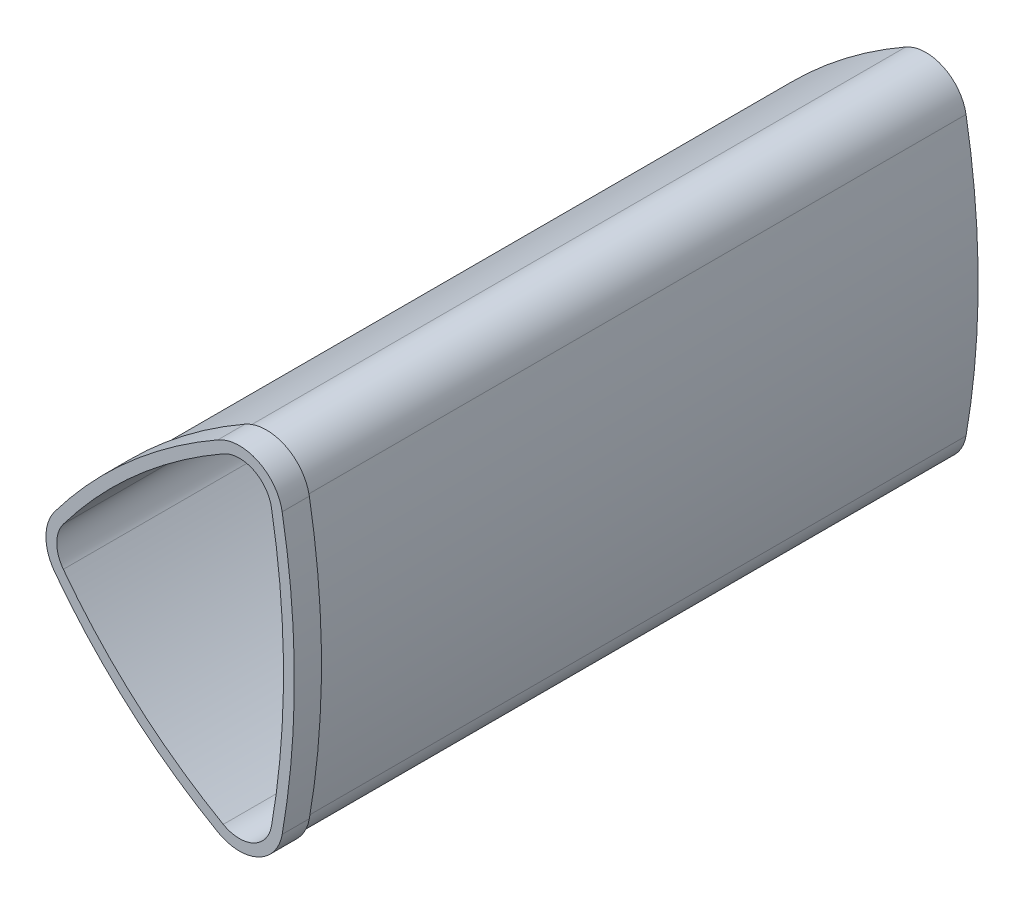
ISO-10303-21;
HEADER;
FILE_DESCRIPTION(('STEP AP214'),'2;1');
FILE_NAME('part.step','',(''),(''),'','','');
FILE_SCHEMA(('AUTOMOTIVE_DESIGN { 1 0 10303 214 1 1 1 1 }'));
ENDSEC;
DATA;
#1=APPLICATION_CONTEXT('core data for automotive mechanical design processes');
#2=APPLICATION_PROTOCOL_DEFINITION('international standard','automotive_design',2000,#1);
#3=PRODUCT_CONTEXT('',#1,'mechanical');
#4=PRODUCT('Part','Part','',(#3));
#5=PRODUCT_RELATED_PRODUCT_CATEGORY('part','',(#4));
#6=PRODUCT_DEFINITION_FORMATION('','',#4);
#7=PRODUCT_DEFINITION_CONTEXT('part definition',#1,'design');
#8=PRODUCT_DEFINITION('design','',#6,#7);
#9=PRODUCT_DEFINITION_SHAPE('','',#8);
#10=(LENGTH_UNIT() NAMED_UNIT(*) SI_UNIT(.MILLI.,.METRE.));
#11=(NAMED_UNIT(*) PLANE_ANGLE_UNIT() SI_UNIT($,.RADIAN.));
#12=(NAMED_UNIT(*) SI_UNIT($,.STERADIAN.) SOLID_ANGLE_UNIT());
#13=UNCERTAINTY_MEASURE_WITH_UNIT(LENGTH_MEASURE(1.E-05),#10,'distance_accuracy_value','');
#14=(GEOMETRIC_REPRESENTATION_CONTEXT(3) GLOBAL_UNCERTAINTY_ASSIGNED_CONTEXT((#13)) GLOBAL_UNIT_ASSIGNED_CONTEXT((#10,
#11,#12)) REPRESENTATION_CONTEXT('',''));
#15=CARTESIAN_POINT('',(0.,0.,0.));
#16=DIRECTION('',(0.,0.,1.));
#17=DIRECTION('',(1.,0.,0.));
#18=AXIS2_PLACEMENT_3D('',#15,#16,#17);
#19=CARTESIAN_POINT('',(7.29,-48.71,3.));
#20=DIRECTION('',(0.,0.,-1.));
#21=DIRECTION('',(-1.,0.,0.));
#22=AXIS2_PLACEMENT_3D('',#19,#20,#21);
#23=CYLINDRICAL_SURFACE('',#22,15.);
#24=CARTESIAN_POINT('',(7.29,-48.71,243.));
#25=DIRECTION('',(0.,0.,1.));
#26=DIRECTION('',(1.,0.,0.));
#27=AXIS2_PLACEMENT_3D('',#24,#25,#26);
#28=CIRCLE('',#27,15.);
#29=CARTESIAN_POINT('',(-0.139087029674166,-61.7410654171302,243.));
#30=VERTEX_POINT('',#29);
#31=CARTESIAN_POINT('',(22.0645368627523,-51.3009574468086,243.));
#32=VERTEX_POINT('',#31);
#33=EDGE_CURVE('E259',#30,#32,#28,.T.);
#34=ORIENTED_EDGE('',*,*,#33,.F.);
#35=DIRECTION('',(0.,0.,-1.));
#36=VECTOR('',#35,1.);
#37=CARTESIAN_POINT('',(-0.139087029674106,-61.7410654171302,3.));
#38=LINE('',#37,#36);
#39=CARTESIAN_POINT('',(-0.139087029674106,-61.7410654171302,0.));
#40=VERTEX_POINT('',#39);
#41=EDGE_CURVE('E268',#30,#40,#38,.T.);
#42=ORIENTED_EDGE('',*,*,#41,.T.);
#43=CARTESIAN_POINT('',(7.29,-48.71,0.));
#44=DIRECTION('',(0.,0.,1.));
#45=DIRECTION('',(1.,0.,0.));
#46=AXIS2_PLACEMENT_3D('',#43,#44,#45);
#47=CIRCLE('',#46,15.);
#48=CARTESIAN_POINT('',(22.0645368627523,-51.3009574468086,0.));
#49=VERTEX_POINT('',#48);
#50=EDGE_CURVE('E302',#40,#49,#47,.T.);
#51=ORIENTED_EDGE('',*,*,#50,.T.);
#52=DIRECTION('',(0.,0.,-1.));
#53=VECTOR('',#52,1.);
#54=CARTESIAN_POINT('',(22.0645368627523,-51.3009574468086,3.));
#55=LINE('',#54,#53);
#56=EDGE_CURVE('E12',#32,#49,#55,.T.);
#57=ORIENTED_EDGE('',*,*,#56,.F.);
#58=EDGE_LOOP('',(#34,#42,#51,#57));
#59=FACE_BOUND('',#58,.T.);
#60=ADVANCED_FACE('F131',(#59),#23,.T.);
#61=CARTESIAN_POINT('',(-270.471293019744,0.,3.));
#62=DIRECTION('',(0.,0.,-1.));
#63=DIRECTION('',(-1.,0.,0.));
#64=AXIS2_PLACEMENT_3D('',#61,#62,#63);
#65=CYLINDRICAL_SURFACE('',#64,297.);
#66=CARTESIAN_POINT('',(-270.471293019744,0.,243.));
#67=DIRECTION('',(0.,0.,1.));
#68=DIRECTION('',(1.,0.,0.));
#69=AXIS2_PLACEMENT_3D('',#66,#67,#68);
#70=CIRCLE('',#69,297.);
#71=CARTESIAN_POINT('',(22.0645368627523,51.3009574468085,243.));
#72=VERTEX_POINT('',#71);
#73=EDGE_CURVE('E269',#32,#72,#70,.T.);
#74=ORIENTED_EDGE('',*,*,#73,.F.);
#75=ORIENTED_EDGE('',*,*,#56,.T.);
#76=CARTESIAN_POINT('',(-270.471293019744,0.,0.));
#77=DIRECTION('',(0.,0.,1.));
#78=DIRECTION('',(1.,0.,0.));
#79=AXIS2_PLACEMENT_3D('',#76,#77,#78);
#80=CIRCLE('',#79,297.);
#81=CARTESIAN_POINT('',(22.0645368627523,51.3009574468085,0.));
#82=VERTEX_POINT('',#81);
#83=EDGE_CURVE('E299',#49,#82,#80,.T.);
#84=ORIENTED_EDGE('',*,*,#83,.T.);
#85=DIRECTION('',(0.,0.,-1.));
#86=VECTOR('',#85,1.);
#87=CARTESIAN_POINT('',(22.0645368627523,51.3009574468085,3.));
#88=LINE('',#87,#86);
#89=EDGE_CURVE('E143',#72,#82,#88,.T.);
#90=ORIENTED_EDGE('',*,*,#89,.F.);
#91=EDGE_LOOP('',(#74,#75,#84,#90));
#92=FACE_BOUND('',#91,.T.);
#93=ADVANCED_FACE('F296',(#92),#65,.T.);
#94=CARTESIAN_POINT('',(7.28999999999999,48.71,3.));
#95=DIRECTION('',(0.,0.,-1.));
#96=DIRECTION('',(-1.,0.,0.));
#97=AXIS2_PLACEMENT_3D('',#94,#95,#96);
#98=CYLINDRICAL_SURFACE('',#97,15.);
#99=DIRECTION('',(0.,0.,-1.));
#100=VECTOR('',#99,1.);
#101=CARTESIAN_POINT('',(-0.139087029674106,61.7410654171303,3.));
#102=LINE('',#101,#100);
#103=CARTESIAN_POINT('',(-0.139087029674106,61.7410654171303,243.));
#104=VERTEX_POINT('',#103);
#105=CARTESIAN_POINT('',(-0.139087029674106,61.7410654171303,0.));
#106=VERTEX_POINT('',#105);
#107=EDGE_CURVE('E283',#104,#106,#102,.T.);
#108=ORIENTED_EDGE('',*,*,#107,.F.);
#109=CARTESIAN_POINT('',(7.28999999999999,48.71,243.));
#110=DIRECTION('',(0.,0.,1.));
#111=DIRECTION('',(1.,0.,0.));
#112=AXIS2_PLACEMENT_3D('',#109,#110,#111);
#113=CIRCLE('',#112,15.);
#114=EDGE_CURVE('E293',#72,#104,#113,.T.);
#115=ORIENTED_EDGE('',*,*,#114,.F.);
#116=ORIENTED_EDGE('',*,*,#89,.T.);
#117=CARTESIAN_POINT('',(7.28999999999999,48.71,0.));
#118=DIRECTION('',(0.,0.,-1.));
#119=DIRECTION('',(-1.,0.,0.));
#120=AXIS2_PLACEMENT_3D('',#117,#118,#119);
#121=CIRCLE('',#120,15.);
#122=EDGE_CURVE('E294',#106,#82,#121,.T.);
#123=ORIENTED_EDGE('',*,*,#122,.F.);
#124=EDGE_LOOP('',(#108,#115,#116,#123));
#125=FACE_BOUND('',#124,.T.);
#126=ADVANCED_FACE('F295',(#125),#98,.T.);
#127=CARTESIAN_POINT('',(97.4295892933787,-109.400260394514,3.));
#128=DIRECTION('',(0.,0.,-1.));
#129=DIRECTION('',(-1.,0.,0.));
#130=AXIS2_PLACEMENT_3D('',#127,#128,#129);
#131=CYLINDRICAL_SURFACE('',#130,197.);
#132=CARTESIAN_POINT('',(97.4295892933787,-109.400260394514,243.));
#133=DIRECTION('',(0.,0.,1.));
#134=DIRECTION('',(1.,0.,0.));
#135=AXIS2_PLACEMENT_3D('',#132,#133,#134);
#136=CIRCLE('',#135,197.);
#137=CARTESIAN_POINT('',(-60.0076035131906,9.01650497756986,243.));
#138=VERTEX_POINT('',#137);
#139=EDGE_CURVE('E413',#104,#138,#136,.T.);
#140=ORIENTED_EDGE('',*,*,#139,.F.);
#141=ORIENTED_EDGE('',*,*,#107,.T.);
#142=CARTESIAN_POINT('',(97.4295892933787,-109.400260394514,0.));
#143=DIRECTION('',(0.,0.,1.));
#144=DIRECTION('',(1.,0.,0.));
#145=AXIS2_PLACEMENT_3D('',#142,#143,#144);
#146=CIRCLE('',#145,197.);
#147=CARTESIAN_POINT('',(-60.0076035131906,9.01650497756987,0.));
#148=VERTEX_POINT('',#147);
#149=EDGE_CURVE('E306',#106,#148,#146,.T.);
#150=ORIENTED_EDGE('',*,*,#149,.T.);
#151=DIRECTION('',(0.,0.,-1.));
#152=VECTOR('',#151,1.);
#153=CARTESIAN_POINT('',(-60.0076035131906,9.01650497756987,3.));
#154=LINE('',#153,#152);
#155=EDGE_CURVE('E279',#138,#148,#154,.T.);
#156=ORIENTED_EDGE('',*,*,#155,.F.);
#157=EDGE_LOOP('',(#140,#141,#150,#156));
#158=FACE_BOUND('',#157,.T.);
#159=ADVANCED_FACE('F419',(#158),#131,.T.);
#160=CARTESIAN_POINT('',(-48.02,0.,3.));
#161=DIRECTION('',(0.,0.,-1.));
#162=DIRECTION('',(-1.,0.,0.));
#163=AXIS2_PLACEMENT_3D('',#160,#161,#162);
#164=CYLINDRICAL_SURFACE('',#163,15.);
#165=CARTESIAN_POINT('',(-48.02,0.,243.));
#166=DIRECTION('',(0.,0.,1.));
#167=DIRECTION('',(1.,0.,0.));
#168=AXIS2_PLACEMENT_3D('',#165,#166,#167);
#169=CIRCLE('',#168,15.);
#170=CARTESIAN_POINT('',(-60.0076035131905,-9.01650497756984,243.));
#171=VERTEX_POINT('',#170);
#172=EDGE_CURVE('E146',#138,#171,#169,.T.);
#173=ORIENTED_EDGE('',*,*,#172,.F.);
#174=ORIENTED_EDGE('',*,*,#155,.T.);
#175=CARTESIAN_POINT('',(-48.02,0.,0.));
#176=DIRECTION('',(0.,0.,1.));
#177=DIRECTION('',(1.,0.,0.));
#178=AXIS2_PLACEMENT_3D('',#175,#176,#177);
#179=CIRCLE('',#178,15.);
#180=CARTESIAN_POINT('',(-60.0076035131905,-9.01650497756984,0.));
#181=VERTEX_POINT('',#180);
#182=EDGE_CURVE('E278',#148,#181,#179,.T.);
#183=ORIENTED_EDGE('',*,*,#182,.T.);
#184=DIRECTION('',(0.,0.,-1.));
#185=VECTOR('',#184,1.);
#186=CARTESIAN_POINT('',(-60.0076035131905,-9.01650497756984,3.));
#187=LINE('',#186,#185);
#188=EDGE_CURVE('E277',#171,#181,#187,.T.);
#189=ORIENTED_EDGE('',*,*,#188,.F.);
#190=EDGE_LOOP('',(#173,#174,#183,#189));
#191=FACE_BOUND('',#190,.T.);
#192=ADVANCED_FACE('F314',(#191),#164,.T.);
#193=CARTESIAN_POINT('',(97.4295892933787,109.400260394514,3.));
#194=DIRECTION('',(0.,0.,-1.));
#195=DIRECTION('',(-1.,0.,0.));
#196=AXIS2_PLACEMENT_3D('',#193,#194,#195);
#197=CYLINDRICAL_SURFACE('',#196,197.);
#198=ORIENTED_EDGE('',*,*,#41,.F.);
#199=CARTESIAN_POINT('',(97.4295892933787,109.400260394514,243.));
#200=DIRECTION('',(0.,0.,1.));
#201=DIRECTION('',(1.,0.,0.));
#202=AXIS2_PLACEMENT_3D('',#199,#200,#201);
#203=CIRCLE('',#202,197.);
#204=EDGE_CURVE('E254',#171,#30,#203,.T.);
#205=ORIENTED_EDGE('',*,*,#204,.F.);
#206=ORIENTED_EDGE('',*,*,#188,.T.);
#207=CARTESIAN_POINT('',(97.4295892933787,109.400260394514,0.));
#208=DIRECTION('',(0.,0.,-1.));
#209=DIRECTION('',(-1.,0.,0.));
#210=AXIS2_PLACEMENT_3D('',#207,#208,#209);
#211=CIRCLE('',#210,197.);
#212=EDGE_CURVE('E274',#40,#181,#211,.T.);
#213=ORIENTED_EDGE('',*,*,#212,.F.);
#214=EDGE_LOOP('',(#198,#205,#206,#213));
#215=FACE_BOUND('',#214,.T.);
#216=ADVANCED_FACE('F272',(#215),#197,.T.);
#217=CARTESIAN_POINT('',(-131.590646509872,-24.355,3.));
#218=DIRECTION('',(0.,0.,1.));
#219=DIRECTION('',(1.,0.,0.));
#220=AXIS2_PLACEMENT_3D('',#217,#218,#219);
#221=PLANE('',#220);
#222=CARTESIAN_POINT('',(0.,0.,3.));
#223=DIRECTION('',(0.,0.,1.));
#224=DIRECTION('',(1.,0.,0.));
#225=AXIS2_PLACEMENT_3D('',#222,#223,#224);
#226=CIRCLE('',#225,12.5);
#227=CARTESIAN_POINT('',(12.5,0.,3.));
#228=VERTEX_POINT('',#227);
#229=EDGE_CURVE('E316',#228,#228,#226,.T.);
#230=ORIENTED_EDGE('',*,*,#229,.F.);
#231=EDGE_LOOP('',(#230));
#232=FACE_BOUND('',#231,.T.);
#233=CARTESIAN_POINT('',(-48.02,0.,3.));
#234=DIRECTION('',(0.,0.,1.));
#235=DIRECTION('',(1.,0.,0.));
#236=AXIS2_PLACEMENT_3D('',#233,#234,#235);
#237=CIRCLE('',#236,12.);
#238=CARTESIAN_POINT('',(-57.6100828105525,7.2132039820559,3.));
#239=VERTEX_POINT('',#238);
#240=CARTESIAN_POINT('',(-57.6100828105525,-7.21320398205578,3.));
#241=VERTEX_POINT('',#240);
#242=EDGE_CURVE('E337',#239,#241,#237,.T.);
#243=ORIENTED_EDGE('',*,*,#242,.T.);
#244=CARTESIAN_POINT('',(97.4295892933787,109.400260394514,3.));
#245=DIRECTION('',(0.,0.,1.));
#246=DIRECTION('',(1.,0.,0.));
#247=AXIS2_PLACEMENT_3D('',#244,#245,#246);
#248=CIRCLE('',#247,194.);
#249=CARTESIAN_POINT('',(1.34673037626065,-59.1348523337041,3.));
#250=VERTEX_POINT('',#249);
#251=EDGE_CURVE('E355',#241,#250,#248,.T.);
#252=ORIENTED_EDGE('',*,*,#251,.T.);
#253=CARTESIAN_POINT('',(7.29,-48.71,3.));
#254=DIRECTION('',(0.,0.,1.));
#255=DIRECTION('',(1.,0.,0.));
#256=AXIS2_PLACEMENT_3D('',#253,#254,#255);
#257=CIRCLE('',#256,12.);
#258=CARTESIAN_POINT('',(19.1096294902019,-50.7827659574469,3.));
#259=VERTEX_POINT('',#258);
#260=EDGE_CURVE('E349',#250,#259,#257,.T.);
#261=ORIENTED_EDGE('',*,*,#260,.T.);
#262=CARTESIAN_POINT('',(-270.471293019744,0.,3.));
#263=DIRECTION('',(0.,0.,1.));
#264=DIRECTION('',(1.,0.,0.));
#265=AXIS2_PLACEMENT_3D('',#262,#263,#264);
#266=CIRCLE('',#265,294.);
#267=CARTESIAN_POINT('',(19.1096294902019,50.7827659574468,3.));
#268=VERTEX_POINT('',#267);
#269=EDGE_CURVE('E347',#259,#268,#266,.T.);
#270=ORIENTED_EDGE('',*,*,#269,.T.);
#271=CARTESIAN_POINT('',(7.28999999999999,48.71,3.));
#272=DIRECTION('',(0.,0.,1.));
#273=DIRECTION('',(1.,0.,0.));
#274=AXIS2_PLACEMENT_3D('',#271,#272,#273);
#275=CIRCLE('',#274,12.);
#276=CARTESIAN_POINT('',(1.34673037626071,59.1348523337043,3.));
#277=VERTEX_POINT('',#276);
#278=EDGE_CURVE('E344',#268,#277,#275,.T.);
#279=ORIENTED_EDGE('',*,*,#278,.T.);
#280=CARTESIAN_POINT('',(97.4295892933787,-109.400260394514,3.));
#281=DIRECTION('',(0.,0.,1.));
#282=DIRECTION('',(1.,0.,0.));
#283=AXIS2_PLACEMENT_3D('',#280,#281,#282);
#284=CIRCLE('',#283,194.);
#285=EDGE_CURVE('E338',#277,#239,#284,.T.);
#286=ORIENTED_EDGE('',*,*,#285,.T.);
#287=EDGE_LOOP('',(#243,#252,#261,#270,#279,#286));
#288=FACE_BOUND('',#287,.T.);
#289=ADVANCED_FACE('F464',(#232,#288),#221,.T.);
#290=CARTESIAN_POINT('',(-131.590646509872,-24.355,0.));
#291=DIRECTION('',(0.,0.,1.));
#292=DIRECTION('',(1.,0.,0.));
#293=AXIS2_PLACEMENT_3D('',#290,#291,#292);
#294=PLANE('',#293);
#295=ORIENTED_EDGE('',*,*,#50,.F.);
#296=ORIENTED_EDGE('',*,*,#212,.T.);
#297=ORIENTED_EDGE('',*,*,#182,.F.);
#298=ORIENTED_EDGE('',*,*,#149,.F.);
#299=ORIENTED_EDGE('',*,*,#122,.T.);
#300=ORIENTED_EDGE('',*,*,#83,.F.);
#301=EDGE_LOOP('',(#295,#296,#297,#298,#299,#300));
#302=FACE_BOUND('',#301,.T.);
#303=CARTESIAN_POINT('',(0.,0.,0.));
#304=DIRECTION('',(0.,0.,1.));
#305=DIRECTION('',(1.,0.,0.));
#306=AXIS2_PLACEMENT_3D('',#303,#304,#305);
#307=CIRCLE('',#306,12.5);
#308=CARTESIAN_POINT('',(12.5,0.,0.));
#309=VERTEX_POINT('',#308);
#310=EDGE_CURVE('E318',#309,#309,#307,.T.);
#311=ORIENTED_EDGE('',*,*,#310,.T.);
#312=EDGE_LOOP('',(#311));
#313=FACE_BOUND('',#312,.T.);
#314=ADVANCED_FACE('F301',(#302,#313),#294,.F.);
#315=CARTESIAN_POINT('',(0.,0.,3.));
#316=DIRECTION('',(0.,0.,-1.));
#317=DIRECTION('',(-1.,0.,0.));
#318=AXIS2_PLACEMENT_3D('',#315,#316,#317);
#319=CYLINDRICAL_SURFACE('',#318,12.5);
#320=ORIENTED_EDGE('',*,*,#229,.T.);
#321=EDGE_LOOP('',(#320));
#322=FACE_BOUND('',#321,.T.);
#323=ORIENTED_EDGE('',*,*,#310,.F.);
#324=EDGE_LOOP('',(#323));
#325=FACE_BOUND('',#324,.T.);
#326=ADVANCED_FACE('F526',(#322,#325),#319,.F.);
#327=CARTESIAN_POINT('',(52.3597946466893,30.345130197257,253.));
#328=DIRECTION('',(0.,0.,1.));
#329=DIRECTION('',(1.,0.,0.));
#330=AXIS2_PLACEMENT_3D('',#327,#328,#329);
#331=PLANE('',#330);
#332=CARTESIAN_POINT('',(7.29,-48.71,253.));
#333=DIRECTION('',(0.,0.,1.));
#334=DIRECTION('',(1.,0.,0.));
#335=AXIS2_PLACEMENT_3D('',#332,#333,#334);
#336=CIRCLE('',#335,12.);
#337=CARTESIAN_POINT('',(1.34673037626065,-59.1348523337041,253.));
#338=VERTEX_POINT('',#337);
#339=CARTESIAN_POINT('',(19.1096294902019,-50.7827659574469,253.));
#340=VERTEX_POINT('',#339);
#341=EDGE_CURVE('E365',#338,#340,#336,.T.);
#342=ORIENTED_EDGE('',*,*,#341,.F.);
#343=CARTESIAN_POINT('',(97.4295892933787,109.400260394514,253.));
#344=DIRECTION('',(0.,0.,1.));
#345=DIRECTION('',(1.,0.,0.));
#346=AXIS2_PLACEMENT_3D('',#343,#344,#345);
#347=CIRCLE('',#346,194.);
#348=CARTESIAN_POINT('',(-57.6100828105525,-7.21320398205577,253.));
#349=VERTEX_POINT('',#348);
#350=EDGE_CURVE('E336',#349,#338,#347,.T.);
#351=ORIENTED_EDGE('',*,*,#350,.F.);
#352=CARTESIAN_POINT('',(-48.02,0.,253.));
#353=DIRECTION('',(0.,0.,1.));
#354=DIRECTION('',(1.,0.,0.));
#355=AXIS2_PLACEMENT_3D('',#352,#353,#354);
#356=CIRCLE('',#355,12.);
#357=CARTESIAN_POINT('',(-57.6100828105525,7.2132039820559,253.));
#358=VERTEX_POINT('',#357);
#359=EDGE_CURVE('E333',#358,#349,#356,.T.);
#360=ORIENTED_EDGE('',*,*,#359,.F.);
#361=CARTESIAN_POINT('',(97.4295892933787,-109.400260394514,253.));
#362=DIRECTION('',(0.,0.,1.));
#363=DIRECTION('',(1.,0.,0.));
#364=AXIS2_PLACEMENT_3D('',#361,#362,#363);
#365=CIRCLE('',#364,194.);
#366=CARTESIAN_POINT('',(1.34673037626071,59.1348523337043,253.));
#367=VERTEX_POINT('',#366);
#368=EDGE_CURVE('E360',#367,#358,#365,.T.);
#369=ORIENTED_EDGE('',*,*,#368,.F.);
#370=CARTESIAN_POINT('',(7.28999999999999,48.71,253.));
#371=DIRECTION('',(0.,0.,1.));
#372=DIRECTION('',(1.,0.,0.));
#373=AXIS2_PLACEMENT_3D('',#370,#371,#372);
#374=CIRCLE('',#373,12.);
#375=CARTESIAN_POINT('',(19.1096294902019,50.7827659574468,253.));
#376=VERTEX_POINT('',#375);
#377=EDGE_CURVE('E358',#376,#367,#374,.T.);
#378=ORIENTED_EDGE('',*,*,#377,.F.);
#379=CARTESIAN_POINT('',(-270.471293019744,0.,253.));
#380=DIRECTION('',(0.,0.,1.));
#381=DIRECTION('',(1.,0.,0.));
#382=AXIS2_PLACEMENT_3D('',#379,#380,#381);
#383=CIRCLE('',#382,294.);
#384=EDGE_CURVE('E362',#340,#376,#383,.T.);
#385=ORIENTED_EDGE('',*,*,#384,.F.);
#386=EDGE_LOOP('',(#342,#351,#360,#369,#378,#385));
#387=FACE_BOUND('',#386,.T.);
#388=CARTESIAN_POINT('',(97.4295892933787,109.400260394514,253.));
#389=DIRECTION('',(0.,0.,1.));
#390=DIRECTION('',(1.,0.,0.));
#391=AXIS2_PLACEMENT_3D('',#388,#389,#390);
#392=CIRCLE('',#391,198.);
#393=CARTESIAN_POINT('',(-60.8067770807367,-9.6176053094077,253.));
#394=VERTEX_POINT('',#393);
#395=CARTESIAN_POINT('',(-0.634359498319111,-62.6098031116055,253.));
#396=VERTEX_POINT('',#395);
#397=EDGE_CURVE('E393',#394,#396,#392,.T.);
#398=ORIENTED_EDGE('',*,*,#397,.T.);
#399=CARTESIAN_POINT('',(7.29,-48.71,253.));
#400=DIRECTION('',(0.,0.,1.));
#401=DIRECTION('',(1.,0.,0.));
#402=AXIS2_PLACEMENT_3D('',#399,#400,#401);
#403=CIRCLE('',#402,16.);
#404=CARTESIAN_POINT('',(23.0495059869358,-51.4736879432625,253.));
#405=VERTEX_POINT('',#404);
#406=EDGE_CURVE('E395',#396,#405,#403,.T.);
#407=ORIENTED_EDGE('',*,*,#406,.T.);
#408=CARTESIAN_POINT('',(-270.471293019744,0.,253.));
#409=DIRECTION('',(0.,0.,1.));
#410=DIRECTION('',(1.,0.,0.));
#411=AXIS2_PLACEMENT_3D('',#408,#409,#410);
#412=CIRCLE('',#411,298.);
#413=CARTESIAN_POINT('',(23.0495059869358,51.4736879432624,253.));
#414=VERTEX_POINT('',#413);
#415=EDGE_CURVE('E386',#405,#414,#412,.T.);
#416=ORIENTED_EDGE('',*,*,#415,.T.);
#417=CARTESIAN_POINT('',(7.28999999999999,48.71,253.));
#418=DIRECTION('',(0.,0.,1.));
#419=DIRECTION('',(1.,0.,0.));
#420=AXIS2_PLACEMENT_3D('',#417,#418,#419);
#421=CIRCLE('',#420,16.);
#422=CARTESIAN_POINT('',(-0.634359498319054,62.6098031116057,253.));
#423=VERTEX_POINT('',#422);
#424=EDGE_CURVE('E387',#414,#423,#421,.T.);
#425=ORIENTED_EDGE('',*,*,#424,.T.);
#426=CARTESIAN_POINT('',(97.4295892933787,-109.400260394514,253.));
#427=DIRECTION('',(0.,0.,1.));
#428=DIRECTION('',(1.,0.,0.));
#429=AXIS2_PLACEMENT_3D('',#426,#427,#428);
#430=CIRCLE('',#429,198.);
#431=CARTESIAN_POINT('',(-60.8067770807366,9.61760530940785,253.));
#432=VERTEX_POINT('',#431);
#433=EDGE_CURVE('E382',#423,#432,#430,.T.);
#434=ORIENTED_EDGE('',*,*,#433,.T.);
#435=CARTESIAN_POINT('',(-48.02,0.,253.));
#436=DIRECTION('',(0.,0.,1.));
#437=DIRECTION('',(1.,0.,0.));
#438=AXIS2_PLACEMENT_3D('',#435,#436,#437);
#439=CIRCLE('',#438,16.);
#440=EDGE_CURVE('E377',#432,#394,#439,.T.);
#441=ORIENTED_EDGE('',*,*,#440,.T.);
#442=EDGE_LOOP('',(#398,#407,#416,#425,#434,#441));
#443=FACE_BOUND('',#442,.T.);
#444=ADVANCED_FACE('F516',(#387,#443),#331,.T.);
#445=CARTESIAN_POINT('',(97.4295892933787,109.400260394514,253.));
#446=DIRECTION('',(0.,0.,-1.));
#447=DIRECTION('',(-1.,0.,0.));
#448=AXIS2_PLACEMENT_3D('',#445,#446,#447);
#449=CYLINDRICAL_SURFACE('',#448,194.);
#450=ORIENTED_EDGE('',*,*,#251,.F.);
#451=DIRECTION('',(0.,0.,-1.));
#452=VECTOR('',#451,1.);
#453=CARTESIAN_POINT('',(-57.6100828105525,-7.21320398205577,253.));
#454=LINE('',#453,#452);
#455=EDGE_CURVE('E156',#349,#241,#454,.T.);
#456=ORIENTED_EDGE('',*,*,#455,.F.);
#457=ORIENTED_EDGE('',*,*,#350,.T.);
#458=DIRECTION('',(0.,0.,-1.));
#459=VECTOR('',#458,1.);
#460=CARTESIAN_POINT('',(1.34673037626065,-59.1348523337041,253.));
#461=LINE('',#460,#459);
#462=EDGE_CURVE('E325',#338,#250,#461,.T.);
#463=ORIENTED_EDGE('',*,*,#462,.T.);
#464=EDGE_LOOP('',(#450,#456,#457,#463));
#465=FACE_BOUND('',#464,.T.);
#466=ADVANCED_FACE('F508',(#465),#449,.F.);
#467=CARTESIAN_POINT('',(7.29,-48.71,253.));
#468=DIRECTION('',(0.,0.,-1.));
#469=DIRECTION('',(-1.,0.,0.));
#470=AXIS2_PLACEMENT_3D('',#467,#468,#469);
#471=CYLINDRICAL_SURFACE('',#470,12.);
#472=ORIENTED_EDGE('',*,*,#260,.F.);
#473=ORIENTED_EDGE('',*,*,#462,.F.);
#474=ORIENTED_EDGE('',*,*,#341,.T.);
#475=DIRECTION('',(0.,0.,-1.));
#476=VECTOR('',#475,1.);
#477=CARTESIAN_POINT('',(19.1096294902019,-50.7827659574469,253.));
#478=LINE('',#477,#476);
#479=EDGE_CURVE('E326',#340,#259,#478,.T.);
#480=ORIENTED_EDGE('',*,*,#479,.T.);
#481=EDGE_LOOP('',(#472,#473,#474,#480));
#482=FACE_BOUND('',#481,.T.);
#483=ADVANCED_FACE('F502',(#482),#471,.F.);
#484=CARTESIAN_POINT('',(-270.471293019744,0.,253.));
#485=DIRECTION('',(0.,0.,-1.));
#486=DIRECTION('',(-1.,0.,0.));
#487=AXIS2_PLACEMENT_3D('',#484,#485,#486);
#488=CYLINDRICAL_SURFACE('',#487,294.);
#489=ORIENTED_EDGE('',*,*,#269,.F.);
#490=ORIENTED_EDGE('',*,*,#479,.F.);
#491=ORIENTED_EDGE('',*,*,#384,.T.);
#492=DIRECTION('',(0.,0.,-1.));
#493=VECTOR('',#492,1.);
#494=CARTESIAN_POINT('',(19.1096294902019,50.7827659574468,253.));
#495=LINE('',#494,#493);
#496=EDGE_CURVE('E327',#376,#268,#495,.T.);
#497=ORIENTED_EDGE('',*,*,#496,.T.);
#498=EDGE_LOOP('',(#489,#490,#491,#497));
#499=FACE_BOUND('',#498,.T.);
#500=ADVANCED_FACE('F495',(#499),#488,.F.);
#501=CARTESIAN_POINT('',(7.28999999999999,48.71,253.));
#502=DIRECTION('',(0.,0.,-1.));
#503=DIRECTION('',(-1.,0.,0.));
#504=AXIS2_PLACEMENT_3D('',#501,#502,#503);
#505=CYLINDRICAL_SURFACE('',#504,12.);
#506=ORIENTED_EDGE('',*,*,#278,.F.);
#507=ORIENTED_EDGE('',*,*,#496,.F.);
#508=ORIENTED_EDGE('',*,*,#377,.T.);
#509=DIRECTION('',(0.,0.,-1.));
#510=VECTOR('',#509,1.);
#511=CARTESIAN_POINT('',(1.34673037626071,59.1348523337043,253.));
#512=LINE('',#511,#510);
#513=EDGE_CURVE('E329',#367,#277,#512,.T.);
#514=ORIENTED_EDGE('',*,*,#513,.T.);
#515=EDGE_LOOP('',(#506,#507,#508,#514));
#516=FACE_BOUND('',#515,.T.);
#517=ADVANCED_FACE('F483',(#516),#505,.F.);
#518=CARTESIAN_POINT('',(97.4295892933787,-109.400260394514,253.));
#519=DIRECTION('',(0.,0.,-1.));
#520=DIRECTION('',(-1.,0.,0.));
#521=AXIS2_PLACEMENT_3D('',#518,#519,#520);
#522=CYLINDRICAL_SURFACE('',#521,194.);
#523=ORIENTED_EDGE('',*,*,#285,.F.);
#524=ORIENTED_EDGE('',*,*,#513,.F.);
#525=ORIENTED_EDGE('',*,*,#368,.T.);
#526=DIRECTION('',(0.,0.,-1.));
#527=VECTOR('',#526,1.);
#528=CARTESIAN_POINT('',(-57.6100828105525,7.2132039820559,253.));
#529=LINE('',#528,#527);
#530=EDGE_CURVE('E335',#358,#239,#529,.T.);
#531=ORIENTED_EDGE('',*,*,#530,.T.);
#532=EDGE_LOOP('',(#523,#524,#525,#531));
#533=FACE_BOUND('',#532,.T.);
#534=ADVANCED_FACE('F474',(#533),#522,.F.);
#535=CARTESIAN_POINT('',(-48.02,0.,253.));
#536=DIRECTION('',(0.,0.,-1.));
#537=DIRECTION('',(-1.,0.,0.));
#538=AXIS2_PLACEMENT_3D('',#535,#536,#537);
#539=CYLINDRICAL_SURFACE('',#538,12.);
#540=ORIENTED_EDGE('',*,*,#242,.F.);
#541=ORIENTED_EDGE('',*,*,#530,.F.);
#542=ORIENTED_EDGE('',*,*,#359,.T.);
#543=ORIENTED_EDGE('',*,*,#455,.T.);
#544=EDGE_LOOP('',(#540,#541,#542,#543));
#545=FACE_BOUND('',#544,.T.);
#546=ADVANCED_FACE('F468',(#545),#539,.F.);
#547=CARTESIAN_POINT('',(97.4295892933787,109.400260394514,243.));
#548=DIRECTION('',(0.,0.,1.));
#549=DIRECTION('',(1.,0.,0.));
#550=AXIS2_PLACEMENT_3D('',#547,#548,#549);
#551=CYLINDRICAL_SURFACE('',#550,198.);
#552=ORIENTED_EDGE('',*,*,#397,.F.);
#553=DIRECTION('',(0.,0.,1.));
#554=VECTOR('',#553,1.);
#555=CARTESIAN_POINT('',(-60.8067770807367,-9.6176053094077,243.));
#556=LINE('',#555,#554);
#557=CARTESIAN_POINT('',(-60.8067770807367,-9.6176053094077,243.));
#558=VERTEX_POINT('',#557);
#559=EDGE_CURVE('E353',#558,#394,#556,.T.);
#560=ORIENTED_EDGE('',*,*,#559,.F.);
#561=CARTESIAN_POINT('',(97.4295892933787,109.400260394514,243.));
#562=DIRECTION('',(0.,0.,1.));
#563=DIRECTION('',(1.,0.,0.));
#564=AXIS2_PLACEMENT_3D('',#561,#562,#563);
#565=CIRCLE('',#564,198.);
#566=CARTESIAN_POINT('',(-0.634359498319111,-62.6098031116055,243.));
#567=VERTEX_POINT('',#566);
#568=EDGE_CURVE('E385',#558,#567,#565,.T.);
#569=ORIENTED_EDGE('',*,*,#568,.T.);
#570=DIRECTION('',(0.,0.,1.));
#571=VECTOR('',#570,1.);
#572=CARTESIAN_POINT('',(-0.634359498319111,-62.6098031116055,243.));
#573=LINE('',#572,#571);
#574=EDGE_CURVE('E370',#567,#396,#573,.T.);
#575=ORIENTED_EDGE('',*,*,#574,.T.);
#576=EDGE_LOOP('',(#552,#560,#569,#575));
#577=FACE_BOUND('',#576,.T.);
#578=ADVANCED_FACE('F475',(#577),#551,.T.);
#579=CARTESIAN_POINT('',(-48.02,0.,243.));
#580=DIRECTION('',(0.,0.,1.));
#581=DIRECTION('',(1.,0.,0.));
#582=AXIS2_PLACEMENT_3D('',#579,#580,#581);
#583=CYLINDRICAL_SURFACE('',#582,16.);
#584=ORIENTED_EDGE('',*,*,#440,.F.);
#585=DIRECTION('',(0.,0.,1.));
#586=VECTOR('',#585,1.);
#587=CARTESIAN_POINT('',(-60.8067770807366,9.61760530940785,243.));
#588=LINE('',#587,#586);
#589=CARTESIAN_POINT('',(-60.8067770807366,9.61760530940785,243.));
#590=VERTEX_POINT('',#589);
#591=EDGE_CURVE('E376',#590,#432,#588,.T.);
#592=ORIENTED_EDGE('',*,*,#591,.F.);
#593=CARTESIAN_POINT('',(-48.02,0.,243.));
#594=DIRECTION('',(0.,0.,1.));
#595=DIRECTION('',(1.,0.,0.));
#596=AXIS2_PLACEMENT_3D('',#593,#594,#595);
#597=CIRCLE('',#596,16.);
#598=EDGE_CURVE('E367',#590,#558,#597,.T.);
#599=ORIENTED_EDGE('',*,*,#598,.T.);
#600=ORIENTED_EDGE('',*,*,#559,.T.);
#601=EDGE_LOOP('',(#584,#592,#599,#600));
#602=FACE_BOUND('',#601,.T.);
#603=ADVANCED_FACE('F562',(#602),#583,.T.);
#604=CARTESIAN_POINT('',(97.4295892933787,-109.400260394514,243.));
#605=DIRECTION('',(0.,0.,1.));
#606=DIRECTION('',(1.,0.,0.));
#607=AXIS2_PLACEMENT_3D('',#604,#605,#606);
#608=CYLINDRICAL_SURFACE('',#607,198.);
#609=ORIENTED_EDGE('',*,*,#433,.F.);
#610=DIRECTION('',(0.,0.,1.));
#611=VECTOR('',#610,1.);
#612=CARTESIAN_POINT('',(-0.634359498319054,62.6098031116057,243.));
#613=LINE('',#612,#611);
#614=CARTESIAN_POINT('',(-0.634359498319054,62.6098031116057,243.));
#615=VERTEX_POINT('',#614);
#616=EDGE_CURVE('E372',#615,#423,#613,.T.);
#617=ORIENTED_EDGE('',*,*,#616,.F.);
#618=CARTESIAN_POINT('',(97.4295892933787,-109.400260394514,243.));
#619=DIRECTION('',(0.,0.,1.));
#620=DIRECTION('',(1.,0.,0.));
#621=AXIS2_PLACEMENT_3D('',#618,#619,#620);
#622=CIRCLE('',#621,198.);
#623=EDGE_CURVE('E398',#615,#590,#622,.T.);
#624=ORIENTED_EDGE('',*,*,#623,.T.);
#625=ORIENTED_EDGE('',*,*,#591,.T.);
#626=EDGE_LOOP('',(#609,#617,#624,#625));
#627=FACE_BOUND('',#626,.T.);
#628=ADVANCED_FACE('F571',(#627),#608,.T.);
#629=CARTESIAN_POINT('',(7.28999999999999,48.71,243.));
#630=DIRECTION('',(0.,0.,1.));
#631=DIRECTION('',(1.,0.,0.));
#632=AXIS2_PLACEMENT_3D('',#629,#630,#631);
#633=CYLINDRICAL_SURFACE('',#632,16.);
#634=ORIENTED_EDGE('',*,*,#424,.F.);
#635=DIRECTION('',(0.,0.,1.));
#636=VECTOR('',#635,1.);
#637=CARTESIAN_POINT('',(23.0495059869358,51.4736879432624,243.));
#638=LINE('',#637,#636);
#639=CARTESIAN_POINT('',(23.0495059869358,51.4736879432624,243.));
#640=VERTEX_POINT('',#639);
#641=EDGE_CURVE('E375',#640,#414,#638,.T.);
#642=ORIENTED_EDGE('',*,*,#641,.F.);
#643=CARTESIAN_POINT('',(7.28999999999999,48.71,243.));
#644=DIRECTION('',(0.,0.,1.));
#645=DIRECTION('',(1.,0.,0.));
#646=AXIS2_PLACEMENT_3D('',#643,#644,#645);
#647=CIRCLE('',#646,16.);
#648=EDGE_CURVE('E401',#640,#615,#647,.T.);
#649=ORIENTED_EDGE('',*,*,#648,.T.);
#650=ORIENTED_EDGE('',*,*,#616,.T.);
#651=EDGE_LOOP('',(#634,#642,#649,#650));
#652=FACE_BOUND('',#651,.T.);
#653=ADVANCED_FACE('F568',(#652),#633,.T.);
#654=CARTESIAN_POINT('',(-270.471293019744,0.,243.));
#655=DIRECTION('',(0.,0.,1.));
#656=DIRECTION('',(1.,0.,0.));
#657=AXIS2_PLACEMENT_3D('',#654,#655,#656);
#658=CYLINDRICAL_SURFACE('',#657,298.);
#659=ORIENTED_EDGE('',*,*,#415,.F.);
#660=DIRECTION('',(0.,0.,1.));
#661=VECTOR('',#660,1.);
#662=CARTESIAN_POINT('',(23.0495059869358,-51.4736879432625,243.));
#663=LINE('',#662,#661);
#664=CARTESIAN_POINT('',(23.0495059869358,-51.4736879432625,243.));
#665=VERTEX_POINT('',#664);
#666=EDGE_CURVE('E369',#665,#405,#663,.T.);
#667=ORIENTED_EDGE('',*,*,#666,.F.);
#668=CARTESIAN_POINT('',(-270.471293019744,0.,243.));
#669=DIRECTION('',(0.,0.,1.));
#670=DIRECTION('',(1.,0.,0.));
#671=AXIS2_PLACEMENT_3D('',#668,#669,#670);
#672=CIRCLE('',#671,298.);
#673=EDGE_CURVE('E407',#665,#640,#672,.T.);
#674=ORIENTED_EDGE('',*,*,#673,.T.);
#675=ORIENTED_EDGE('',*,*,#641,.T.);
#676=EDGE_LOOP('',(#659,#667,#674,#675));
#677=FACE_BOUND('',#676,.T.);
#678=ADVANCED_FACE('F567',(#677),#658,.T.);
#679=CARTESIAN_POINT('',(7.29,-48.71,243.));
#680=DIRECTION('',(0.,0.,1.));
#681=DIRECTION('',(1.,0.,0.));
#682=AXIS2_PLACEMENT_3D('',#679,#680,#681);
#683=CYLINDRICAL_SURFACE('',#682,16.);
#684=ORIENTED_EDGE('',*,*,#406,.F.);
#685=ORIENTED_EDGE('',*,*,#574,.F.);
#686=CARTESIAN_POINT('',(7.29,-48.71,243.));
#687=DIRECTION('',(0.,0.,1.));
#688=DIRECTION('',(1.,0.,0.));
#689=AXIS2_PLACEMENT_3D('',#686,#687,#688);
#690=CIRCLE('',#689,16.);
#691=EDGE_CURVE('E406',#567,#665,#690,.T.);
#692=ORIENTED_EDGE('',*,*,#691,.T.);
#693=ORIENTED_EDGE('',*,*,#666,.T.);
#694=EDGE_LOOP('',(#684,#685,#692,#693));
#695=FACE_BOUND('',#694,.T.);
#696=ADVANCED_FACE('F564',(#695),#683,.T.);
#697=CARTESIAN_POINT('',(52.3597946466893,30.345130197257,243.));
#698=DIRECTION('',(0.,0.,1.));
#699=DIRECTION('',(1.,0.,0.));
#700=AXIS2_PLACEMENT_3D('',#697,#698,#699);
#701=PLANE('',#700);
#702=ORIENTED_EDGE('',*,*,#172,.T.);
#703=ORIENTED_EDGE('',*,*,#204,.T.);
#704=ORIENTED_EDGE('',*,*,#33,.T.);
#705=ORIENTED_EDGE('',*,*,#73,.T.);
#706=ORIENTED_EDGE('',*,*,#114,.T.);
#707=ORIENTED_EDGE('',*,*,#139,.T.);
#708=EDGE_LOOP('',(#702,#703,#704,#705,#706,#707));
#709=FACE_BOUND('',#708,.T.);
#710=ORIENTED_EDGE('',*,*,#568,.F.);
#711=ORIENTED_EDGE('',*,*,#598,.F.);
#712=ORIENTED_EDGE('',*,*,#623,.F.);
#713=ORIENTED_EDGE('',*,*,#648,.F.);
#714=ORIENTED_EDGE('',*,*,#673,.F.);
#715=ORIENTED_EDGE('',*,*,#691,.F.);
#716=EDGE_LOOP('',(#710,#711,#712,#713,#714,#715));
#717=FACE_BOUND('',#716,.T.);
#718=ADVANCED_FACE('F260',(#709,#717),#701,.F.);
#719=CLOSED_SHELL('',(#60,#93,#126,#159,#192,#216,#289,#314,#326,#444,#466,#483,#500,#517,#534,
#546,#578,#603,#628,#653,#678,#696,#718));
#720=MANIFOLD_SOLID_BREP('B2',#719);
#721=ADVANCED_BREP_SHAPE_REPRESENTATION('',(#18,#720),#14);
#722=SHAPE_DEFINITION_REPRESENTATION(#9,#721);
ENDSEC;
END-ISO-10303-21;
